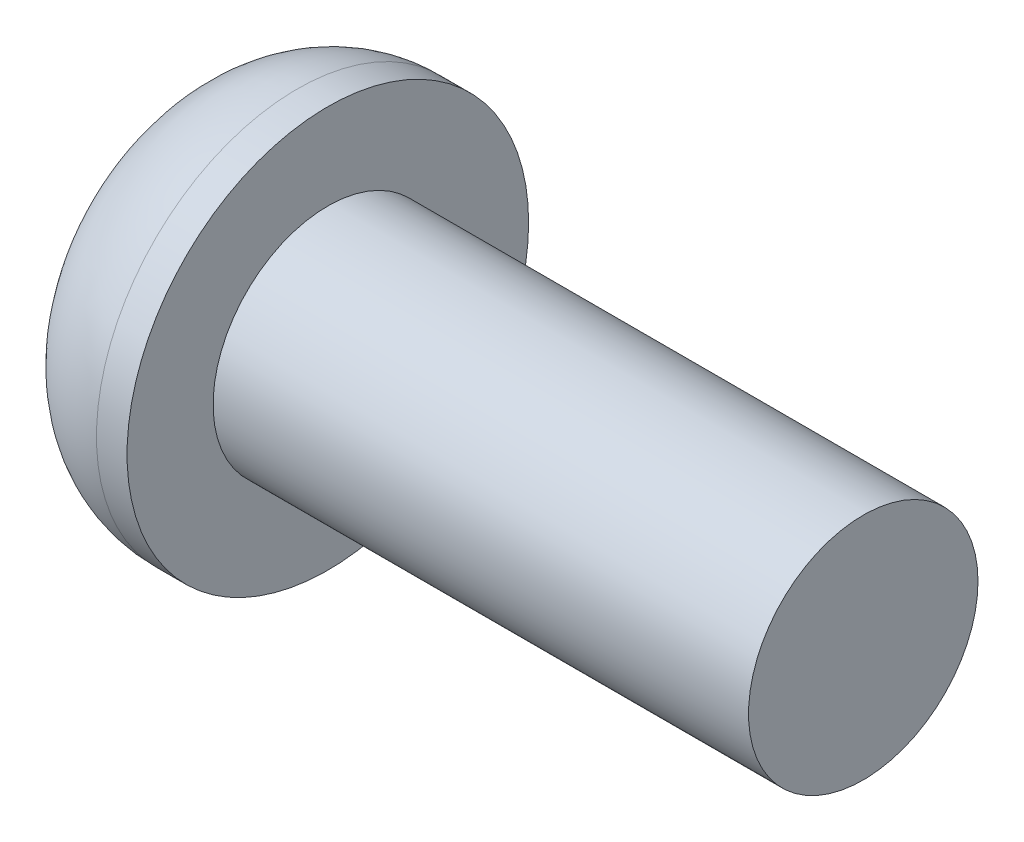
ISO-10303-21;
HEADER;
FILE_DESCRIPTION(('STEP AP214'),'2;1');
FILE_NAME('part.step','',(''),(''),'','','');
FILE_SCHEMA(('AUTOMOTIVE_DESIGN { 1 0 10303 214 1 1 1 1 }'));
ENDSEC;
DATA;
#1=APPLICATION_CONTEXT('core data for automotive mechanical design processes');
#2=APPLICATION_PROTOCOL_DEFINITION('international standard','automotive_design',2000,#1);
#3=PRODUCT_CONTEXT('',#1,'mechanical');
#4=PRODUCT('Part','Part','',(#3));
#5=PRODUCT_RELATED_PRODUCT_CATEGORY('part','',(#4));
#6=PRODUCT_DEFINITION_FORMATION('','',#4);
#7=PRODUCT_DEFINITION_CONTEXT('part definition',#1,'design');
#8=PRODUCT_DEFINITION('design','',#6,#7);
#9=PRODUCT_DEFINITION_SHAPE('','',#8);
#10=(LENGTH_UNIT() NAMED_UNIT(*) SI_UNIT(.MILLI.,.METRE.));
#11=(NAMED_UNIT(*) PLANE_ANGLE_UNIT() SI_UNIT($,.RADIAN.));
#12=(NAMED_UNIT(*) SI_UNIT($,.STERADIAN.) SOLID_ANGLE_UNIT());
#13=UNCERTAINTY_MEASURE_WITH_UNIT(LENGTH_MEASURE(1.E-05),#10,'distance_accuracy_value','');
#14=(GEOMETRIC_REPRESENTATION_CONTEXT(3) GLOBAL_UNCERTAINTY_ASSIGNED_CONTEXT((#13)) GLOBAL_UNIT_ASSIGNED_CONTEXT((#10,
#11,#12)) REPRESENTATION_CONTEXT('',''));
#15=CARTESIAN_POINT('',(0.,0.,0.));
#16=DIRECTION('',(0.,0.,1.));
#17=DIRECTION('',(1.,0.,0.));
#18=AXIS2_PLACEMENT_3D('',#15,#16,#17);
#19=CARTESIAN_POINT('',(0.,0.,0.));
#20=DIRECTION('',(-1.,0.,0.));
#21=DIRECTION('',(0.,0.,1.));
#22=AXIS2_PLACEMENT_3D('',#19,#20,#21);
#23=PLANE('',#22);
#24=DIRECTION('',(0.,0.866025403784439,0.5));
#25=VECTOR('',#24,1.);
#26=CARTESIAN_POINT('',(0.,-2.,1.15470053837925));
#27=LINE('',#26,#25);
#28=CARTESIAN_POINT('',(0.,-1.38971143170225,1.50705080756931));
#29=VERTEX_POINT('',#28);
#30=CARTESIAN_POINT('',(0.,-0.610288568297747,1.95705080756845));
#31=VERTEX_POINT('',#30);
#32=EDGE_CURVE('E161',#29,#31,#27,.T.);
#33=ORIENTED_EDGE('',*,*,#32,.F.);
#34=CARTESIAN_POINT('',(0.,0.,0.));
#35=DIRECTION('',(1.,0.,0.));
#36=DIRECTION('',(0.,0.,-1.));
#37=AXIS2_PLACEMENT_3D('',#34,#35,#36);
#38=CIRCLE('',#37,2.04999999999981);
#39=EDGE_CURVE('E284',#31,#29,#38,.T.);
#40=ORIENTED_EDGE('',*,*,#39,.F.);
#41=EDGE_LOOP('',(#33,#40));
#42=FACE_BOUND('',#41,.T.);
#43=ADVANCED_FACE('F32',(#42),#23,.T.);
#44=DIRECTION('',(0.,0.,1.));
#45=VECTOR('',#44,1.);
#46=CARTESIAN_POINT('',(0.,-2.,-1.15470053837925));
#47=LINE('',#46,#45);
#48=CARTESIAN_POINT('',(0.,-2.,-0.449999999999147));
#49=VERTEX_POINT('',#48);
#50=CARTESIAN_POINT('',(0.,-2.,0.449999999999148));
#51=VERTEX_POINT('',#50);
#52=EDGE_CURVE('E149',#49,#51,#47,.T.);
#53=ORIENTED_EDGE('',*,*,#52,.F.);
#54=EDGE_CURVE('E287',#51,#49,#38,.T.);
#55=ORIENTED_EDGE('',*,*,#54,.F.);
#56=EDGE_LOOP('',(#53,#55));
#57=FACE_BOUND('',#56,.T.);
#58=ADVANCED_FACE('F259',(#57),#23,.T.);
#59=DIRECTION('',(0.,-0.866025403784439,0.5));
#60=VECTOR('',#59,1.);
#61=CARTESIAN_POINT('',(0.,0.,-2.3094010767585));
#62=LINE('',#61,#60);
#63=CARTESIAN_POINT('',(0.,-0.610288568297741,-1.95705080756845));
#64=VERTEX_POINT('',#63);
#65=CARTESIAN_POINT('',(0.,-1.38971143170226,-1.5070508075693));
#66=VERTEX_POINT('',#65);
#67=EDGE_CURVE('E151',#64,#66,#62,.T.);
#68=ORIENTED_EDGE('',*,*,#67,.F.);
#69=EDGE_CURVE('E193',#66,#64,#38,.T.);
#70=ORIENTED_EDGE('',*,*,#69,.F.);
#71=EDGE_LOOP('',(#68,#70));
#72=FACE_BOUND('',#71,.T.);
#73=ADVANCED_FACE('F264',(#72),#23,.T.);
#74=DIRECTION('',(0.,-0.866025403784439,-0.5));
#75=VECTOR('',#74,1.);
#76=CARTESIAN_POINT('',(0.,2.,-1.15470053837925));
#77=LINE('',#76,#75);
#78=CARTESIAN_POINT('',(0.,1.38971143170226,-1.5070508075693));
#79=VERTEX_POINT('',#78);
#80=CARTESIAN_POINT('',(0.,0.610288568297742,-1.95705080756845));
#81=VERTEX_POINT('',#80);
#82=EDGE_CURVE('E166',#79,#81,#77,.T.);
#83=ORIENTED_EDGE('',*,*,#82,.F.);
#84=EDGE_CURVE('E194',#81,#79,#38,.T.);
#85=ORIENTED_EDGE('',*,*,#84,.F.);
#86=EDGE_LOOP('',(#83,#85));
#87=FACE_BOUND('',#86,.T.);
#88=ADVANCED_FACE('F276',(#87),#23,.T.);
#89=DIRECTION('',(0.,0.,-1.));
#90=VECTOR('',#89,1.);
#91=CARTESIAN_POINT('',(0.,2.,1.15470053837925));
#92=LINE('',#91,#90);
#93=CARTESIAN_POINT('',(0.,2.,0.449999999999146));
#94=VERTEX_POINT('',#93);
#95=CARTESIAN_POINT('',(0.,2.,-0.449999999999146));
#96=VERTEX_POINT('',#95);
#97=EDGE_CURVE('E164',#94,#96,#92,.T.);
#98=ORIENTED_EDGE('',*,*,#97,.F.);
#99=EDGE_CURVE('E198',#96,#94,#38,.T.);
#100=ORIENTED_EDGE('',*,*,#99,.F.);
#101=EDGE_LOOP('',(#98,#100));
#102=FACE_BOUND('',#101,.T.);
#103=ADVANCED_FACE('F268',(#102),#23,.T.);
#104=DIRECTION('',(0.,0.866025403784438,-0.5));
#105=VECTOR('',#104,1.);
#106=CARTESIAN_POINT('',(0.,0.,2.3094010767585));
#107=LINE('',#106,#105);
#108=CARTESIAN_POINT('',(0.,0.610288568297739,1.95705080756845));
#109=VERTEX_POINT('',#108);
#110=CARTESIAN_POINT('',(0.,1.38971143170226,1.5070508075693));
#111=VERTEX_POINT('',#110);
#112=EDGE_CURVE('E54',#109,#111,#107,.T.);
#113=ORIENTED_EDGE('',*,*,#112,.F.);
#114=EDGE_CURVE('E280',#111,#109,#38,.T.);
#115=ORIENTED_EDGE('',*,*,#114,.F.);
#116=EDGE_LOOP('',(#113,#115));
#117=FACE_BOUND('',#116,.T.);
#118=ADVANCED_FACE('F34',(#117),#23,.T.);
#119=CARTESIAN_POINT('',(3.20000000000019,0.,0.));
#120=DIRECTION('',(1.,0.,0.));
#121=DIRECTION('',(0.,0.,-1.));
#122=AXIS2_PLACEMENT_3D('',#119,#120,#121);
#123=DEGENERATE_TOROIDAL_SURFACE('',#122,2.04999999999981,3.20000000000019,.T.);
#124=CARTESIAN_POINT('',(0.0105406167446231,-2.0002,1.15458506832541));
#125=CARTESIAN_POINT('',(0.00664117854912433,-1.91688229776464,1.20268856613926));
#126=CARTESIAN_POINT('',(0.00417753331699307,-1.83353495783843,1.2508091752819));
#127=CARTESIAN_POINT('',(0.00106794947529185,-1.66682683048704,1.34705815748432));
#128=CARTESIAN_POINT('',(0.000421687089793824,-1.58346604810348,1.39518652763333));
#129=CARTESIAN_POINT('',(-0.00010761911535643,-1.41675645251678,1.4914363575218));
#130=CARTESIAN_POINT('',(9.25192736784387E-06,-1.33340763901583,1.53955781743321));
#131=CARTESIAN_POINT('',(0.000258385583432403,-1.16670588369395,1.63580312074268));
#132=CARTESIAN_POINT('',(0.000390648844765858,-1.08335294184698,1.68392696415578));
#133=CARTESIAN_POINT('',(0.000390648844765839,-0.916647058153024,1.78017465098198));
#134=CARTESIAN_POINT('',(0.000258385583432365,-0.833294116306049,1.82829849439507));
#135=CARTESIAN_POINT('',(9.25192736768791E-06,-0.666592360984166,1.92454379770455));
#136=CARTESIAN_POINT('',(-0.000107619115356685,-0.583243547483225,1.97266525761595));
#137=CARTESIAN_POINT('',(0.000421687089793677,-0.416533951896519,2.06891508750443));
#138=CARTESIAN_POINT('',(0.00106794947529191,-0.333173169512959,2.11704345765344));
#139=CARTESIAN_POINT('',(0.00417753331699326,-0.166465042161575,2.21329243985586));
#140=CARTESIAN_POINT('',(0.00664117854912444,-0.0831177022353576,2.2614130489985));
#141=CARTESIAN_POINT('',(0.0105406167446227,0.000199999999999651,2.30951654681234));
#142=B_SPLINE_CURVE_WITH_KNOTS('',3,(#124,#125,#126,#127,#128,#129,#130,#131,#132,#133,#134,
#135,#136,#137,#138,#139,#140,#141),.UNSPECIFIED.,.F.,.F.,(4,2,2,2,2,2,2,2,4),(0.,
0.288814329937899,0.577577202884326,0.866307861064927,1.15505067884557,1.44379349662621,
1.73252415480681,2.02128702775324,2.31010135769114),.UNSPECIFIED.);
#143=CARTESIAN_POINT('',(0.010531222698118,-2.,1.15470053837925));
#144=VERTEX_POINT('',#143);
#145=EDGE_CURVE('E11',#144,#29,#142,.T.);
#146=ORIENTED_EDGE('',*,*,#145,.F.);
#147=CARTESIAN_POINT('',(0.000390648844563418,-2.,0.));
#148=CARTESIAN_POINT('',(0.000388916290291673,-2.,0.083614024419002));
#149=CARTESIAN_POINT('',(0.000294961016210183,-2.,0.167228029526292));
#150=CARTESIAN_POINT('',(7.33656011319928E-05,-2.,0.334456689951084));
#151=CARTESIAN_POINT('',(-5.42749462442094E-05,-2.,0.418071345264261));
#152=CARTESIAN_POINT('',(9.9026167139026E-05,-2.,0.585336453695913));
#153=CARTESIAN_POINT('',(0.000380135255697929,-2.,0.668986907444867));
#154=CARTESIAN_POINT('',(0.00198161498522397,-2.,0.836276681697473));
#155=CARTESIAN_POINT('',(0.00330198450402564,-2.,0.919916002213049));
#156=CARTESIAN_POINT('',(0.00990874177777835,-2.,1.1704859408122));
#157=CARTESIAN_POINT('',(0.0178358773389069,-2.,1.33737685156857));
#158=CARTESIAN_POINT('',(0.0463966327415513,-2.,1.67005295609297));
#159=CARTESIAN_POINT('',(0.0670165227010465,-2.,1.83583914923513));
#160=CARTESIAN_POINT('',(0.114208843632242,-2.,2.10200251044517));
#161=CARTESIAN_POINT('',(0.135545087691405,-2.,2.20330479986803));
#162=CARTESIAN_POINT('',(0.185482432453743,-2.,2.40414359205348));
#163=CARTESIAN_POINT('',(0.214084710757365,-2.,2.50367980578939));
#164=CARTESIAN_POINT('',(0.279081004124637,-2.,2.70024195822511));
#165=CARTESIAN_POINT('',(0.31547855237929,-2.,2.79726673619553));
#166=CARTESIAN_POINT('',(0.396341964437799,-2.,2.98790264127201));
#167=CARTESIAN_POINT('',(0.440807347560848,-2.,3.08151397135212));
#168=CARTESIAN_POINT('',(0.53831581656335,-2.,3.26522431016494));
#169=CARTESIAN_POINT('',(0.591430486610918,-2.,3.3552854627745));
#170=CARTESIAN_POINT('',(0.70583149468764,-2.,3.53005528461691));
#171=CARTESIAN_POINT('',(0.767116948786012,-2.,3.61476453137002));
#172=CARTESIAN_POINT('',(0.8975713102187,-2.,3.77789665733377));
#173=CARTESIAN_POINT('',(0.966739962110468,-2.,3.85631974009742));
#174=CARTESIAN_POINT('',(1.11244341066968,-2.,4.00593761757554));
#175=CARTESIAN_POINT('',(1.18897717676414,-2.,4.07713342071981));
#176=CARTESIAN_POINT('',(1.40990833897083,-2.,4.26275012496424));
#177=CARTESIAN_POINT('',(1.56156159231435,-2.,4.36874590901151));
#178=CARTESIAN_POINT('',(1.8814637605388,-2.,4.55140057351885));
#179=CARTESIAN_POINT('',(2.04970352579627,-2.,4.62807551560914));
#180=CARTESIAN_POINT('',(2.38510548510189,-2.,4.74491683255247));
#181=CARTESIAN_POINT('',(2.55150377531688,-2.,4.78728013566301));
#182=CARTESIAN_POINT('',(2.8890979593217,-2.,4.84270140401037));
#183=CARTESIAN_POINT('',(3.06029286887629,-2.,4.85576533734134));
#184=CARTESIAN_POINT('',(3.39821911147901,-2.,4.85219069552503));
#185=CARTESIAN_POINT('',(3.56495844228162,-2.,4.83626145668961));
#186=CARTESIAN_POINT('',(3.89338943303934,-2.,4.7766133301739));
#187=CARTESIAN_POINT('',(4.05508100895309,-2.,4.73289398006751));
#188=CARTESIAN_POINT('',(4.36886231870803,-2.,4.61912819914962));
#189=CARTESIAN_POINT('',(4.52095405243817,-2.,4.54908727306863));
#190=CARTESIAN_POINT('',(4.81149742496475,-2.,4.38498519058825));
#191=CARTESIAN_POINT('',(4.94995217470088,-2.,4.29092953022426));
#192=CARTESIAN_POINT('',(5.21262747200964,-2.,4.07959825366387));
#193=CARTESIAN_POINT('',(5.33648762736063,-2.,3.96187609776255));
#194=CARTESIAN_POINT('',(5.56401634277204,-2.,3.70807401556308));
#195=CARTESIAN_POINT('',(5.66766260105318,-2.,3.57197409020784));
#196=CARTESIAN_POINT('',(5.80925789457159,-2.,3.35336895715406));
#197=CARTESIAN_POINT('',(5.85513676414212,-2.,3.27586118775976));
#198=CARTESIAN_POINT('',(5.94075735307755,-2.,3.11750322211606));
#199=CARTESIAN_POINT('',(5.98049865995432,-2.,3.03665280167909));
#200=CARTESIAN_POINT('',(6.05373032179732,-2.,2.87250868437411));
#201=CARTESIAN_POINT('',(6.08724117500105,-2.,2.78922408159436));
#202=CARTESIAN_POINT('',(6.14832834364035,-2.,2.62051986915736));
#203=CARTESIAN_POINT('',(6.17590501872864,-2.,2.53510038923904));
#204=CARTESIAN_POINT('',(6.22585565589426,-2.,2.36104083165567));
#205=CARTESIAN_POINT('',(6.24812319958891,-2.,2.27237040187932));
#206=CARTESIAN_POINT('',(6.28720863369723,-2.,2.09382307798533));
#207=CARTESIAN_POINT('',(6.30402502468491,-2.,2.00394585898914));
#208=CARTESIAN_POINT('',(6.33277969102287,-2.,1.82331883882505));
#209=CARTESIAN_POINT('',(6.34471221515045,-2.,1.7325681369683));
#210=CARTESIAN_POINT('',(6.36438163717915,-2.,1.55060528943868));
#211=CARTESIAN_POINT('',(6.3721176372418,-2.,1.4593930492304));
#212=CARTESIAN_POINT('',(6.39041228419079,-2.,1.18335367753333));
#213=CARTESIAN_POINT('',(6.39576430365758,-2.,0.998202228989591));
#214=CARTESIAN_POINT('',(6.39933389036973,-2.,0.720572834661133));
#215=CARTESIAN_POINT('',(6.39978119431541,-2.,0.628072781821954));
#216=CARTESIAN_POINT('',(6.40008789120602,-2.,0.443068700421198));
#217=CARTESIAN_POINT('',(6.39994730306063,-2.,0.350564672083199));
#218=CARTESIAN_POINT('',(6.39969384698773,-2.,0.158105673403426));
#219=CARTESIAN_POINT('',(6.3995841248598,-2.,0.0581508358983932));
#220=CARTESIAN_POINT('',(6.39964817119654,-2.,-0.141759779031458));
#221=CARTESIAN_POINT('',(6.3998219436993,-2.,-0.241715556449384));
#222=CARTESIAN_POINT('',(6.40004002320031,-2.,-0.441727910082696));
#223=CARTESIAN_POINT('',(6.40008420414425,-2.,-0.541784489802096));
#224=CARTESIAN_POINT('',(6.39911991309886,-2.,-0.741883917848651));
#225=CARTESIAN_POINT('',(6.3981114385633,-2.,-0.841926766142006));
#226=CARTESIAN_POINT('',(6.3917035449667,-2.,-1.14004904005377));
#227=CARTESIAN_POINT('',(6.38296997469166,-2.,-1.33814084031703));
#228=CARTESIAN_POINT('',(6.35615694642755,-2.,-1.63392229458638));
#229=CARTESIAN_POINT('',(6.34494882028323,-2.,-1.73220894241901));
#230=CARTESIAN_POINT('',(6.31704510109669,-2.,-1.92798927336831));
#231=CARTESIAN_POINT('',(6.30035103300402,-2.,-2.02548316914066));
#232=CARTESIAN_POINT('',(6.2607846351801,-2.,-2.21882928781068));
#233=CARTESIAN_POINT('',(6.23793667940662,-2.,-2.314686433816));
#234=CARTESIAN_POINT('',(6.1854651424377,-2.,-2.50458187761333));
#235=CARTESIAN_POINT('',(6.15583903555902,-2.,-2.59861948320384));
#236=CARTESIAN_POINT('',(6.0893899357679,-2.,-2.7842926126749));
#237=CARTESIAN_POINT('',(6.05255605051094,-2.,-2.87592425998423));
#238=CARTESIAN_POINT('',(5.97152761995712,-2.,-3.05587117794695));
#239=CARTESIAN_POINT('',(5.92733403380227,-2.,-3.14418687891057));
#240=CARTESIAN_POINT('',(5.83123330091599,-2.,-3.31729786425876));
#241=CARTESIAN_POINT('',(5.77927690902879,-2.,-3.40206589534637));
#242=CARTESIAN_POINT('',(5.66800733702573,-2.,-3.56662463346645));
#243=CARTESIAN_POINT('',(5.60869480391146,-2.,-3.6464157773093));
#244=CARTESIAN_POINT('',(5.48297845150779,-2.,-3.80022230829932));
#245=CARTESIAN_POINT('',(5.41657459049872,-2.,-3.87423766146195));
#246=CARTESIAN_POINT('',(5.27713552278688,-2.,-4.01568336960477));
#247=CARTESIAN_POINT('',(5.20410093410765,-2.,-4.08311433707568));
#248=CARTESIAN_POINT('',(4.9873875717098,-2.,-4.26470800310395));
#249=CARTESIAN_POINT('',(4.83621025566948,-2.,-4.37015143241766));
#250=CARTESIAN_POINT('',(4.51739863619901,-2.,-4.55191529677997));
#251=CARTESIAN_POINT('',(4.34977225851968,-2.,-4.62824967182762));
#252=CARTESIAN_POINT('',(4.01504309765868,-2.,-4.74487295816118));
#253=CARTESIAN_POINT('',(3.84866381813474,-2.,-4.7872414191447));
#254=CARTESIAN_POINT('',(3.51110231450898,-2.,-4.84267971245903));
#255=CARTESIAN_POINT('',(3.33992092110264,-2.,-4.85575458089316));
#256=CARTESIAN_POINT('',(3.00200252002735,-2.,-4.85220573152867));
#257=CARTESIAN_POINT('',(2.83525760830666,-2.,-4.83628848486376));
#258=CARTESIAN_POINT('',(2.50682171313129,-2.,-4.77666387015624));
#259=CARTESIAN_POINT('',(2.34513057122483,-2.,-4.73295737431387));
#260=CARTESIAN_POINT('',(2.03135632731202,-2.,-4.61922076936278));
#261=CARTESIAN_POINT('',(1.87927070488133,-2.,-4.54919759937378));
#262=CARTESIAN_POINT('',(1.58871377698702,-2.,-4.38512107031362));
#263=CARTESIAN_POINT('',(1.45024138973157,-2.,-4.29106962281892));
#264=CARTESIAN_POINT('',(1.18750697783543,-2.,-4.07972237571905));
#265=CARTESIAN_POINT('',(1.06360863819637,-2.,-3.96197588388512));
#266=CARTESIAN_POINT('',(0.836074098993482,-2.,-3.70818248771566));
#267=CARTESIAN_POINT('',(0.73244942873765,-2.,-3.57212524415017));
#268=CARTESIAN_POINT('',(0.590908485474325,-2.,-3.35363735787178));
#269=CARTESIAN_POINT('',(0.545063005324332,-2.,-3.27620456086666));
#270=CARTESIAN_POINT('',(0.459497582380795,-2.,-3.11800065969786));
#271=CARTESIAN_POINT('',(0.419778118755337,-2.,-3.03722929502221));
#272=CARTESIAN_POINT('',(0.346514578991059,-2.,-2.87310110634625));
#273=CARTESIAN_POINT('',(0.312960819745775,-2.,-2.78974858082008));
#274=CARTESIAN_POINT('',(0.251799424144532,-2.,-2.62090588620951));
#275=CARTESIAN_POINT('',(0.224191284243009,-2.,-2.53541589883571));
#276=CARTESIAN_POINT('',(0.174133118365059,-2.,-2.36102214502514));
#277=CARTESIAN_POINT('',(0.151802335683953,-2.,-2.27208435860149));
#278=CARTESIAN_POINT('',(0.112622221493986,-2.,-2.09299592722068));
#279=CARTESIAN_POINT('',(0.0957744145119987,-2.,-2.00284495218305));
#280=CARTESIAN_POINT('',(0.0669826531866311,-2.,-1.82166439441248));
#281=CARTESIAN_POINT('',(0.0550446465040569,-2.,-1.73063388197957));
#282=CARTESIAN_POINT('',(0.035383648192888,-2.,-1.54811088866639));
#283=CARTESIAN_POINT('',(0.0276615647918848,-2.,-1.45661831252578));
#284=CARTESIAN_POINT('',(0.00950590732444865,-2.,-1.18097371396941));
#285=CARTESIAN_POINT('',(0.00420221665067436,-2.,-0.996504256603975));
#286=CARTESIAN_POINT('',(0.000663085289595214,-2.,-0.719878155437179));
#287=CARTESIAN_POINT('',(0.000219109813570109,-2.,-0.627699849001262));
#288=CARTESIAN_POINT('',(-8.83657034975882E-05,-2.,-0.44333860757143));
#289=CARTESIAN_POINT('',(4.81185553726301E-05,-2.,-0.35115567277014));
#290=CARTESIAN_POINT('',(0.00023193074307832,-2.,-0.215797133245246));
#291=CARTESIAN_POINT('',(0.000288083367765182,-2.,-0.17262048180127));
#292=CARTESIAN_POINT('',(0.000367878584137435,-2.,-0.0862958851066697));
#293=CARTESIAN_POINT('',(0.000391542906872371,-2.,-0.0431479399820349));
#294=CARTESIAN_POINT('',(0.000390648844563418,-2.,0.));
#295=B_SPLINE_CURVE_WITH_KNOTS('',3,(#147,#148,#149,#150,#151,#152,#153,#154,#155,#156,#157,
#158,#159,#160,#161,#162,#163,#164,#165,#166,#167,#168,#169,#170,#171,#172,#173,#174,#175,#176,
#177,#178,#179,#180,#181,#182,#183,#184,#185,#186,#187,#188,#189,#190,#191,#192,#193,#194,#195,
#196,#197,#198,#199,#200,#201,#202,#203,#204,#205,#206,#207,#208,#209,#210,#211,#212,#213,#214,
#215,#216,#217,#218,#219,#220,#221,#222,#223,#224,#225,#226,#227,#228,#229,#230,#231,#232,#233,
#234,#235,#236,#237,#238,#239,#240,#241,#242,#243,#244,#245,#246,#247,#248,#249,#250,#251,#252,
#253,#254,#255,#256,#257,#258,#259,#260,#261,#262,#263,#264,#265,#266,#267,#268,#269,#270,#271,
#272,#273,#274,#275,#276,#277,#278,#279,#280,#281,#282,#283,#284,#285,#286,#287,#288,#289,#290,
#291,#292,#293,#294),.UNSPECIFIED.,.T.,.F.,(4,2,2,2,2,2,2,2,2,2,2,2,2,2,2,2,2,2,2,2,2,2,2,2,2,2,
2,2,2,2,2,2,2,2,2,2,2,2,2,2,2,2,2,2,2,2,2,2,2,2,2,2,2,2,2,2,2,2,2,2,2,2,2,2,2,2,2,2,2,2,2,2,2,
4),(0.,0.250841940342383,0.501686906982993,0.752634651093908,1.00358212423857,1.50455245545905,
2.0049818319268,2.31532421391156,2.62571692496571,2.93625061977651,3.24676581909208,
3.55999538500628,3.87319109261122,4.18637665448875,4.49951845702196,5.05138568625849,
5.60295017424777,6.11553986346438,6.62802513195474,7.12814022896245,7.62826364807917,
8.12828253265153,8.62818708483043,9.13859998939591,9.64957288039267,9.9195491524335,
10.1895435609226,10.4586333281936,10.7277067821448,11.0017896457224,11.2759478362893,
11.5504279519769,11.8249667690328,12.3803217811837,12.6578385461362,12.9353463847744,
13.2352116537555,13.5350811940492,13.8352423222755,14.1354041765514,14.7296705114639,
15.0263109813449,15.3228690625224,15.6182694003918,15.9137799904988,16.209740651788,
16.5056627725879,16.803548802755,17.1014086512284,17.3992702521662,17.6971041190642,
18.2468740039997,18.7963802786915,19.3089169234534,19.8213654470461,20.3214934147627,
20.8216056861144,21.3215861814327,21.8215269130399,22.3320711250698,22.842904836753,
23.1126371616207,23.3823905738696,23.651716654306,23.9210199160376,24.1959251186072,
24.4709066926646,24.7462204011643,25.0215933965445,25.5749048233596,25.8514562272192,
26.1280001510534,26.2575305861035,26.3869743374607),.UNSPECIFIED.);
#296=EDGE_CURVE('E45',#51,#144,#295,.T.);
#297=ORIENTED_EDGE('',*,*,#296,.F.);
#298=ORIENTED_EDGE('',*,*,#54,.T.);
#299=CARTESIAN_POINT('',(0.0105312226992274,-2.,-1.15470053837925));
#300=VERTEX_POINT('',#299);
#301=EDGE_CURVE('E36',#300,#49,#295,.T.);
#302=ORIENTED_EDGE('',*,*,#301,.F.);
#303=CARTESIAN_POINT('',(0.0105406167446229,0.000200000000000488,-2.30951654681234));
#304=CARTESIAN_POINT('',(0.00664117854912483,-0.0831177022353571,-2.2614130489985));
#305=CARTESIAN_POINT('',(0.00417753331699353,-0.166465042161574,-2.21329243985585));
#306=CARTESIAN_POINT('',(0.00106794947529184,-0.333173169512958,-2.11704345765343));
#307=CARTESIAN_POINT('',(0.000421687089793387,-0.416533951896518,-2.06891508750443));
#308=CARTESIAN_POINT('',(-0.00010761911535704,-0.583243547483225,-1.97266525761595));
#309=CARTESIAN_POINT('',(9.25192736749402E-06,-0.666592360984166,-1.92454379770455));
#310=CARTESIAN_POINT('',(0.000258385583432364,-0.833294116306049,-1.82829849439507));
#311=CARTESIAN_POINT('',(0.000390648844765869,-0.916647058153024,-1.78017465098197));
#312=CARTESIAN_POINT('',(0.000390648844765874,-1.08335294184698,-1.68392696415578));
#313=CARTESIAN_POINT('',(0.000258385583432374,-1.16670588369395,-1.63580312074268));
#314=CARTESIAN_POINT('',(9.25192736751146E-06,-1.33340763901583,-1.53955781743321));
#315=CARTESIAN_POINT('',(-0.00010761911535702,-1.41675645251678,-1.4914363575218));
#316=CARTESIAN_POINT('',(0.000421687089793411,-1.58346604810348,-1.39518652763332));
#317=CARTESIAN_POINT('',(0.00106794947529187,-1.66682683048704,-1.34705815748432));
#318=CARTESIAN_POINT('',(0.00417753331699357,-1.83353495783843,-1.2508091752819));
#319=CARTESIAN_POINT('',(0.00664117854912487,-1.91688229776464,-1.20268856613926));
#320=CARTESIAN_POINT('',(0.0105406167446229,-2.0002,-1.15458506832541));
#321=B_SPLINE_CURVE_WITH_KNOTS('',3,(#303,#304,#305,#306,#307,#308,#309,#310,#311,#312,#313,
#314,#315,#316,#317,#318,#319,#320),.UNSPECIFIED.,.F.,.F.,(4,2,2,2,2,2,2,2,4),(0.,
0.288814329937899,0.577577202884327,0.866307861064928,1.15505067884557,1.44379349662621,
1.73252415480682,2.02128702775324,2.31010135769114),.UNSPECIFIED.);
#322=EDGE_CURVE('E297',#66,#300,#321,.T.);
#323=ORIENTED_EDGE('',*,*,#322,.F.);
#324=ORIENTED_EDGE('',*,*,#69,.T.);
#325=CARTESIAN_POINT('',(0.0105312226992274,0.,-2.3094010767585));
#326=VERTEX_POINT('',#325);
#327=EDGE_CURVE('E238',#326,#64,#321,.T.);
#328=ORIENTED_EDGE('',*,*,#327,.F.);
#329=CARTESIAN_POINT('',(0.0105406167446231,2.0002,-1.15458506832541));
#330=CARTESIAN_POINT('',(0.00664117854912433,1.91688229776464,-1.20268856613926));
#331=CARTESIAN_POINT('',(0.00417753331699307,1.83353495783843,-1.2508091752819));
#332=CARTESIAN_POINT('',(0.00106794947529185,1.66682683048704,-1.34705815748432));
#333=CARTESIAN_POINT('',(0.00042168708979383,1.58346604810348,-1.39518652763332));
#334=CARTESIAN_POINT('',(-0.000107619115356419,1.41675645251678,-1.4914363575218));
#335=CARTESIAN_POINT('',(9.25192736785842E-06,1.33340763901583,-1.53955781743321));
#336=CARTESIAN_POINT('',(0.000258385583432423,1.16670588369395,-1.63580312074268));
#337=CARTESIAN_POINT('',(0.00039064884476588,1.08335294184698,-1.68392696415578));
#338=CARTESIAN_POINT('',(0.000390648844765864,0.916647058153025,-1.78017465098198));
#339=CARTESIAN_POINT('',(0.000258385583432391,0.833294116306049,-1.82829849439507));
#340=CARTESIAN_POINT('',(9.2519273677166E-06,0.666592360984166,-1.92454379770455));
#341=CARTESIAN_POINT('',(-0.000107619115356654,0.583243547483225,-1.97266525761595));
#342=CARTESIAN_POINT('',(0.000421687089793716,0.416533951896519,-2.06891508750443));
#343=CARTESIAN_POINT('',(0.00106794947529195,0.333173169512959,-2.11704345765343));
#344=CARTESIAN_POINT('',(0.0041775333169933,0.166465042161575,-2.21329243985585));
#345=CARTESIAN_POINT('',(0.00664117854912449,0.083117702235358,-2.2614130489985));
#346=CARTESIAN_POINT('',(0.0105406167446227,-0.000199999999999543,-2.30951654681234));
#347=B_SPLINE_CURVE_WITH_KNOTS('',3,(#329,#330,#331,#332,#333,#334,#335,#336,#337,#338,#339,
#340,#341,#342,#343,#344,#345,#346),.UNSPECIFIED.,.F.,.F.,(4,2,2,2,2,2,2,2,4),(0.,
0.288814329937899,0.577577202884326,0.866307861064928,1.15505067884557,1.44379349662621,
1.73252415480681,2.02128702775324,2.31010135769114),.UNSPECIFIED.);
#348=EDGE_CURVE('E237',#81,#326,#347,.T.);
#349=ORIENTED_EDGE('',*,*,#348,.F.);
#350=ORIENTED_EDGE('',*,*,#84,.T.);
#351=CARTESIAN_POINT('',(0.0105312226981085,2.,-1.15470053837925));
#352=VERTEX_POINT('',#351);
#353=EDGE_CURVE('E232',#352,#79,#347,.T.);
#354=ORIENTED_EDGE('',*,*,#353,.F.);
#355=CARTESIAN_POINT('',(0.000390648844563367,2.,0.));
#356=CARTESIAN_POINT('',(0.000388916290291612,2.,-0.0836140244190011));
#357=CARTESIAN_POINT('',(0.000294961016210111,2.,-0.167228029526291));
#358=CARTESIAN_POINT('',(7.33656011319041E-05,2.,-0.334456689951083));
#359=CARTESIAN_POINT('',(-5.42749462443031E-05,2.,-0.41807134526426));
#360=CARTESIAN_POINT('',(9.90261671389232E-05,2.,-0.585336453695912));
#361=CARTESIAN_POINT('',(0.000380135255697822,2.,-0.668986907444866));
#362=CARTESIAN_POINT('',(0.00198161498522386,2.,-0.836276681697472));
#363=CARTESIAN_POINT('',(0.00330198450402554,2.,-0.919916002213048));
#364=CARTESIAN_POINT('',(0.0099087417777783,2.,-1.1704859408122));
#365=CARTESIAN_POINT('',(0.0178358773389069,2.,-1.33737685156857));
#366=CARTESIAN_POINT('',(0.0463966327415514,2.,-1.67005295609297));
#367=CARTESIAN_POINT('',(0.0670165227010465,2.,-1.83583914923513));
#368=CARTESIAN_POINT('',(0.114208843632242,2.,-2.10200251044517));
#369=CARTESIAN_POINT('',(0.135545087691405,2.,-2.20330479986803));
#370=CARTESIAN_POINT('',(0.185482432453743,2.,-2.40414359205348));
#371=CARTESIAN_POINT('',(0.214084710757364,2.,-2.50367980578939));
#372=CARTESIAN_POINT('',(0.279081004124638,2.,-2.70024195822511));
#373=CARTESIAN_POINT('',(0.31547855237929,2.,-2.79726673619553));
#374=CARTESIAN_POINT('',(0.396341964437799,2.,-2.98790264127201));
#375=CARTESIAN_POINT('',(0.440807347560848,2.,-3.08151397135212));
#376=CARTESIAN_POINT('',(0.53831581656335,2.,-3.26522431016494));
#377=CARTESIAN_POINT('',(0.591430486610918,2.,-3.3552854627745));
#378=CARTESIAN_POINT('',(0.70583149468764,2.,-3.53005528461691));
#379=CARTESIAN_POINT('',(0.767116948786011,2.,-3.61476453137002));
#380=CARTESIAN_POINT('',(0.8975713102187,2.,-3.77789665733377));
#381=CARTESIAN_POINT('',(0.966739962110468,2.,-3.85631974009742));
#382=CARTESIAN_POINT('',(1.11244341066968,2.,-4.00593761757554));
#383=CARTESIAN_POINT('',(1.18897717676414,2.,-4.07713342071981));
#384=CARTESIAN_POINT('',(1.40990833897082,2.,-4.26275012496424));
#385=CARTESIAN_POINT('',(1.56156159231435,2.,-4.36874590901151));
#386=CARTESIAN_POINT('',(1.8814637605388,2.,-4.55140057351885));
#387=CARTESIAN_POINT('',(2.04970352579627,2.,-4.62807551560914));
#388=CARTESIAN_POINT('',(2.38510548510189,2.,-4.74491683255247));
#389=CARTESIAN_POINT('',(2.55150377531688,2.,-4.78728013566301));
#390=CARTESIAN_POINT('',(2.8890979593217,2.,-4.84270140401037));
#391=CARTESIAN_POINT('',(3.06029286887629,2.,-4.85576533734134));
#392=CARTESIAN_POINT('',(3.39821911147901,2.,-4.85219069552503));
#393=CARTESIAN_POINT('',(3.56495844228162,2.,-4.8362614566896));
#394=CARTESIAN_POINT('',(3.89338943303934,2.,-4.7766133301739));
#395=CARTESIAN_POINT('',(4.05508100895309,2.,-4.73289398006751));
#396=CARTESIAN_POINT('',(4.36886231870803,2.,-4.61912819914962));
#397=CARTESIAN_POINT('',(4.52095405243817,2.,-4.54908727306863));
#398=CARTESIAN_POINT('',(4.81149742496475,2.,-4.38498519058825));
#399=CARTESIAN_POINT('',(4.94995217470088,2.,-4.29092953022427));
#400=CARTESIAN_POINT('',(5.21262747200964,2.,-4.07959825366387));
#401=CARTESIAN_POINT('',(5.33648762736063,2.,-3.96187609776255));
#402=CARTESIAN_POINT('',(5.56401634277204,2.,-3.70807401556307));
#403=CARTESIAN_POINT('',(5.66766260105318,2.,-3.57197409020784));
#404=CARTESIAN_POINT('',(5.8092578945716,2.,-3.35336895715406));
#405=CARTESIAN_POINT('',(5.85513676414212,2.,-3.27586118775976));
#406=CARTESIAN_POINT('',(5.94075735307755,2.,-3.11750322211605));
#407=CARTESIAN_POINT('',(5.98049865995432,2.,-3.03665280167909));
#408=CARTESIAN_POINT('',(6.05373032179732,2.,-2.87250868437411));
#409=CARTESIAN_POINT('',(6.08724117500105,2.,-2.78922408159436));
#410=CARTESIAN_POINT('',(6.14832834364035,2.,-2.62051986915736));
#411=CARTESIAN_POINT('',(6.17590501872864,2.,-2.53510038923904));
#412=CARTESIAN_POINT('',(6.22585565589426,2.,-2.36104083165567));
#413=CARTESIAN_POINT('',(6.24812319958891,2.,-2.27237040187932));
#414=CARTESIAN_POINT('',(6.28720863369723,2.,-2.09382307798533));
#415=CARTESIAN_POINT('',(6.30402502468491,2.,-2.00394585898914));
#416=CARTESIAN_POINT('',(6.33277969102287,2.,-1.82331883882505));
#417=CARTESIAN_POINT('',(6.34471221515045,2.,-1.7325681369683));
#418=CARTESIAN_POINT('',(6.36438163717915,2.,-1.55060528943868));
#419=CARTESIAN_POINT('',(6.3721176372418,2.,-1.4593930492304));
#420=CARTESIAN_POINT('',(6.39041228419079,2.,-1.18335367753332));
#421=CARTESIAN_POINT('',(6.39576430365758,2.,-0.998202228989588));
#422=CARTESIAN_POINT('',(6.39933389036973,2.,-0.720572834661129));
#423=CARTESIAN_POINT('',(6.39978119431541,2.,-0.628072781821951));
#424=CARTESIAN_POINT('',(6.40008789120602,2.,-0.443068700421195));
#425=CARTESIAN_POINT('',(6.39994730306063,2.,-0.350564672083196));
#426=CARTESIAN_POINT('',(6.39969384698773,2.,-0.158105673403422));
#427=CARTESIAN_POINT('',(6.3995841248598,2.,-0.0581508358983887));
#428=CARTESIAN_POINT('',(6.39964817119654,2.,0.141759779031463));
#429=CARTESIAN_POINT('',(6.3998219436993,2.,0.241715556449389));
#430=CARTESIAN_POINT('',(6.40004002320031,2.,0.4417279100827));
#431=CARTESIAN_POINT('',(6.40008420414425,2.,0.541784489802101));
#432=CARTESIAN_POINT('',(6.39911991309886,2.,0.741883917848656));
#433=CARTESIAN_POINT('',(6.3981114385633,2.,0.841926766142012));
#434=CARTESIAN_POINT('',(6.3917035449667,2.,1.14004904005377));
#435=CARTESIAN_POINT('',(6.38296997469166,2.,1.33814084031704));
#436=CARTESIAN_POINT('',(6.35615694642755,2.,1.63392229458638));
#437=CARTESIAN_POINT('',(6.34494882028323,2.,1.73220894241902));
#438=CARTESIAN_POINT('',(6.31704510109669,2.,1.92798927336832));
#439=CARTESIAN_POINT('',(6.30035103300402,2.,2.02548316914067));
#440=CARTESIAN_POINT('',(6.2607846351801,2.,2.21882928781069));
#441=CARTESIAN_POINT('',(6.23793667940662,2.,2.31468643381601));
#442=CARTESIAN_POINT('',(6.1854651424377,2.,2.50458187761334));
#443=CARTESIAN_POINT('',(6.15583903555902,2.,2.59861948320385));
#444=CARTESIAN_POINT('',(6.08938993576789,2.,2.78429261267491));
#445=CARTESIAN_POINT('',(6.05255605051093,2.,2.87592425998424));
#446=CARTESIAN_POINT('',(5.97152761995712,2.,3.05587117794696));
#447=CARTESIAN_POINT('',(5.92733403380226,2.,3.14418687891058));
#448=CARTESIAN_POINT('',(5.83123330091599,2.,3.31729786425877));
#449=CARTESIAN_POINT('',(5.77927690902879,2.,3.40206589534638));
#450=CARTESIAN_POINT('',(5.66800733702573,2.,3.56662463346646));
#451=CARTESIAN_POINT('',(5.60869480391145,2.,3.64641577730931));
#452=CARTESIAN_POINT('',(5.48297845150778,2.,3.80022230829933));
#453=CARTESIAN_POINT('',(5.41657459049871,2.,3.87423766146196));
#454=CARTESIAN_POINT('',(5.27713552278687,2.,4.01568336960477));
#455=CARTESIAN_POINT('',(5.20410093410765,2.,4.08311433707569));
#456=CARTESIAN_POINT('',(4.98738757170979,2.,4.26470800310395));
#457=CARTESIAN_POINT('',(4.83621025566948,2.,4.37015143241767));
#458=CARTESIAN_POINT('',(4.51739863619901,2.,4.55191529677998));
#459=CARTESIAN_POINT('',(4.34977225851967,2.,4.62824967182762));
#460=CARTESIAN_POINT('',(4.01504309765867,2.,4.74487295816118));
#461=CARTESIAN_POINT('',(3.84866381813473,2.,4.7872414191447));
#462=CARTESIAN_POINT('',(3.51110231450897,2.,4.84267971245903));
#463=CARTESIAN_POINT('',(3.33992092110263,2.,4.85575458089316));
#464=CARTESIAN_POINT('',(3.00200252002735,2.,4.85220573152867));
#465=CARTESIAN_POINT('',(2.83525760830666,2.,4.83628848486376));
#466=CARTESIAN_POINT('',(2.50682171313128,2.,4.77666387015624));
#467=CARTESIAN_POINT('',(2.34513057122483,2.,4.73295737431387));
#468=CARTESIAN_POINT('',(2.03135632731202,2.,4.61922076936278));
#469=CARTESIAN_POINT('',(1.87927070488133,2.,4.54919759937378));
#470=CARTESIAN_POINT('',(1.58871377698701,2.,4.38512107031362));
#471=CARTESIAN_POINT('',(1.45024138973157,2.,4.29106962281892));
#472=CARTESIAN_POINT('',(1.18750697783543,2.,4.07972237571905));
#473=CARTESIAN_POINT('',(1.06360863819636,2.,3.96197588388512));
#474=CARTESIAN_POINT('',(0.83607409899348,2.,3.70818248771566));
#475=CARTESIAN_POINT('',(0.732449428737648,2.,3.57212524415017));
#476=CARTESIAN_POINT('',(0.590908485474324,2.,3.35363735787177));
#477=CARTESIAN_POINT('',(0.545063005324331,2.,3.27620456086666));
#478=CARTESIAN_POINT('',(0.459497582380793,2.,3.11800065969786));
#479=CARTESIAN_POINT('',(0.419778118755336,2.,3.03722929502221));
#480=CARTESIAN_POINT('',(0.346514578991057,2.,2.87310110634625));
#481=CARTESIAN_POINT('',(0.312960819745774,2.,2.78974858082007));
#482=CARTESIAN_POINT('',(0.251799424144531,2.,2.6209058862095));
#483=CARTESIAN_POINT('',(0.224191284243008,2.,2.53541589883571));
#484=CARTESIAN_POINT('',(0.174133118365058,2.,2.36102214502514));
#485=CARTESIAN_POINT('',(0.151802335683953,2.,2.27208435860149));
#486=CARTESIAN_POINT('',(0.112622221493986,2.,2.09299592722068));
#487=CARTESIAN_POINT('',(0.0957744145119976,2.,2.00284495218305));
#488=CARTESIAN_POINT('',(0.0669826531866297,2.,1.82166439441248));
#489=CARTESIAN_POINT('',(0.0550446465040558,2.,1.73063388197956));
#490=CARTESIAN_POINT('',(0.0353836481928875,2.,1.54811088866639));
#491=CARTESIAN_POINT('',(0.0276615647918844,2.,1.45661831252578));
#492=CARTESIAN_POINT('',(0.0095059073244484,2.,1.1809737139694));
#493=CARTESIAN_POINT('',(0.00420221665067431,2.,0.996504256603967));
#494=CARTESIAN_POINT('',(0.000663085289595262,2.,0.71987815543717));
#495=CARTESIAN_POINT('',(0.000219109813570154,2.,0.627699849001253));
#496=CARTESIAN_POINT('',(-8.83657034975605E-05,2.,0.443338607571421));
#497=CARTESIAN_POINT('',(4.81185553726431E-05,2.,0.351155672770131));
#498=CARTESIAN_POINT('',(0.000231930743078306,2.,0.21579713324524));
#499=CARTESIAN_POINT('',(0.000288083367765157,2.,0.172620481801265));
#500=CARTESIAN_POINT('',(0.000367878584137395,2.,0.0862958851066684));
#501=CARTESIAN_POINT('',(0.000391542906872324,2.,0.0431479399820347));
#502=CARTESIAN_POINT('',(0.000390648844563367,2.,0.));
#503=B_SPLINE_CURVE_WITH_KNOTS('',3,(#355,#356,#357,#358,#359,#360,#361,#362,#363,#364,#365,
#366,#367,#368,#369,#370,#371,#372,#373,#374,#375,#376,#377,#378,#379,#380,#381,#382,#383,#384,
#385,#386,#387,#388,#389,#390,#391,#392,#393,#394,#395,#396,#397,#398,#399,#400,#401,#402,#403,
#404,#405,#406,#407,#408,#409,#410,#411,#412,#413,#414,#415,#416,#417,#418,#419,#420,#421,#422,
#423,#424,#425,#426,#427,#428,#429,#430,#431,#432,#433,#434,#435,#436,#437,#438,#439,#440,#441,
#442,#443,#444,#445,#446,#447,#448,#449,#450,#451,#452,#453,#454,#455,#456,#457,#458,#459,#460,
#461,#462,#463,#464,#465,#466,#467,#468,#469,#470,#471,#472,#473,#474,#475,#476,#477,#478,#479,
#480,#481,#482,#483,#484,#485,#486,#487,#488,#489,#490,#491,#492,#493,#494,#495,#496,#497,#498,
#499,#500,#501,#502),.UNSPECIFIED.,.T.,.F.,(4,2,2,2,2,2,2,2,2,2,2,2,2,2,2,2,2,2,2,2,2,2,2,2,2,2,
2,2,2,2,2,2,2,2,2,2,2,2,2,2,2,2,2,2,2,2,2,2,2,2,2,2,2,2,2,2,2,2,2,2,2,2,2,2,2,2,2,2,2,2,2,2,2,
4),(0.,0.250841940342383,0.501686906982993,0.752634651093908,1.00358212423857,1.50455245545905,
2.0049818319268,2.31532421391156,2.62571692496571,2.93625061977651,3.24676581909208,
3.55999538500628,3.87319109261122,4.18637665448875,4.49951845702196,5.05138568625849,
5.60295017424777,6.11553986346438,6.62802513195474,7.12814022896245,7.62826364807917,
8.12828253265153,8.62818708483043,9.13859998939591,9.64957288039267,9.9195491524335,
10.1895435609226,10.4586333281936,10.7277067821448,11.0017896457224,11.2759478362893,
11.5504279519769,11.8249667690328,12.3803217811837,12.6578385461362,12.9353463847744,
13.2352116537555,13.5350811940492,13.8352423222755,14.1354041765514,14.729670511464,
15.0263109813449,15.3228690625224,15.6182694003919,15.9137799904988,16.209740651788,
16.5056627725879,16.803548802755,17.1014086512284,17.3992702521662,17.6971041190642,
18.2468740039997,18.7963802786915,19.3089169234534,19.8213654470461,20.3214934147627,
20.8216056861144,21.3215861814327,21.8215269130399,22.3320711250698,22.842904836753,
23.1126371616207,23.3823905738696,23.651716654306,23.9210199160376,24.1959251186072,
24.4709066926646,24.7462204011643,25.0215933965445,25.5749048233596,25.8514562272192,
26.1280001510534,26.2575305861035,26.3869743374607),.UNSPECIFIED.);
#504=EDGE_CURVE('E231',#96,#352,#503,.T.);
#505=ORIENTED_EDGE('',*,*,#504,.F.);
#506=ORIENTED_EDGE('',*,*,#99,.T.);
#507=CARTESIAN_POINT('',(0.0105312226992274,2.,1.15470053837925));
#508=VERTEX_POINT('',#507);
#509=EDGE_CURVE('E205',#508,#94,#503,.T.);
#510=ORIENTED_EDGE('',*,*,#509,.F.);
#511=CARTESIAN_POINT('',(0.010540616744623,-0.000200000000000924,2.30951654681234));
#512=CARTESIAN_POINT('',(0.00664117854912451,0.0831177022353565,2.2614130489985));
#513=CARTESIAN_POINT('',(0.00417753331699336,0.166465042161574,2.21329243985586));
#514=CARTESIAN_POINT('',(0.00106794947529211,0.333173169512958,2.11704345765344));
#515=CARTESIAN_POINT('',(0.000421687089793955,0.416533951896518,2.06891508750443));
#516=CARTESIAN_POINT('',(-0.000107619115356639,0.583243547483225,1.97266525761595));
#517=CARTESIAN_POINT('',(9.25192736743133E-06,0.666592360984166,1.92454379770455));
#518=CARTESIAN_POINT('',(0.000258385583432086,0.833294116306049,1.82829849439507));
#519=CARTESIAN_POINT('',(0.00039064884476584,0.916647058153024,1.78017465098198));
#520=CARTESIAN_POINT('',(0.000390648844765992,1.08335294184698,1.68392696415578));
#521=CARTESIAN_POINT('',(0.000258385583432389,1.16670588369395,1.63580312074268));
#522=CARTESIAN_POINT('',(9.25192736747091E-06,1.33340763901583,1.53955781743321));
#523=CARTESIAN_POINT('',(-0.000107619115357014,1.41675645251678,1.4914363575218));
#524=CARTESIAN_POINT('',(0.000421687089793481,1.58346604810348,1.39518652763332));
#525=CARTESIAN_POINT('',(0.00106794947529196,1.66682683048704,1.34705815748432));
#526=CARTESIAN_POINT('',(0.00417753331699365,1.83353495783843,1.2508091752819));
#527=CARTESIAN_POINT('',(0.00664117854912493,1.91688229776464,1.20268856613926));
#528=CARTESIAN_POINT('',(0.010540616744623,2.0002,1.15458506832541));
#529=B_SPLINE_CURVE_WITH_KNOTS('',3,(#511,#512,#513,#514,#515,#516,#517,#518,#519,#520,#521,
#522,#523,#524,#525,#526,#527,#528),.UNSPECIFIED.,.F.,.F.,(4,2,2,2,2,2,2,2,4),(0.,
0.2888143299379,0.577577202884327,0.866307861064928,1.15505067884557,1.44379349662622,
1.73252415480682,2.02128702775324,2.31010135769114),.UNSPECIFIED.);
#530=EDGE_CURVE('E197',#111,#508,#529,.T.);
#531=ORIENTED_EDGE('',*,*,#530,.F.);
#532=ORIENTED_EDGE('',*,*,#114,.T.);
#533=CARTESIAN_POINT('',(0.0105312226992274,0.,2.3094010767585));
#534=VERTEX_POINT('',#533);
#535=EDGE_CURVE('E206',#534,#109,#529,.T.);
#536=ORIENTED_EDGE('',*,*,#535,.F.);
#537=EDGE_CURVE('E47',#31,#534,#142,.T.);
#538=ORIENTED_EDGE('',*,*,#537,.F.);
#539=ORIENTED_EDGE('',*,*,#39,.T.);
#540=EDGE_LOOP('',(#146,#297,#298,#302,#323,#324,#328,#349,#350,#354,#505,#506,#510,#531,#532,
#536,#538,#539));
#541=FACE_BOUND('',#540,.T.);
#542=CARTESIAN_POINT('',(3.20000000000019,0.,0.));
#543=DIRECTION('',(1.,0.,0.));
#544=DIRECTION('',(0.,0.,-1.));
#545=AXIS2_PLACEMENT_3D('',#542,#543,#544);
#546=CIRCLE('',#545,5.25);
#547=CARTESIAN_POINT('',(3.20000000000019,0.,-5.25));
#548=VERTEX_POINT('',#547);
#549=EDGE_CURVE('E190',#548,#548,#546,.T.);
#550=ORIENTED_EDGE('',*,*,#549,.F.);
#551=EDGE_LOOP('',(#550));
#552=FACE_BOUND('',#551,.T.);
#553=ADVANCED_FACE('F211',(#541,#552),#123,.T.);
#554=CARTESIAN_POINT('',(0.,0.,0.));
#555=DIRECTION('',(1.,0.,0.));
#556=DIRECTION('',(0.,0.,-1.));
#557=AXIS2_PLACEMENT_3D('',#554,#555,#556);
#558=CYLINDRICAL_SURFACE('',#557,5.25);
#559=ORIENTED_EDGE('',*,*,#549,.T.);
#560=EDGE_LOOP('',(#559));
#561=FACE_BOUND('',#560,.T.);
#562=CARTESIAN_POINT('',(4.,0.,0.));
#563=DIRECTION('',(1.,0.,0.));
#564=DIRECTION('',(0.,0.,-1.));
#565=AXIS2_PLACEMENT_3D('',#562,#563,#564);
#566=CIRCLE('',#565,5.25);
#567=CARTESIAN_POINT('',(4.,0.,-5.25));
#568=VERTEX_POINT('',#567);
#569=EDGE_CURVE('E187',#568,#568,#566,.T.);
#570=ORIENTED_EDGE('',*,*,#569,.F.);
#571=EDGE_LOOP('',(#570));
#572=FACE_BOUND('',#571,.T.);
#573=ADVANCED_FACE('F274',(#561,#572),#558,.T.);
#574=CARTESIAN_POINT('',(4.,5.25,0.));
#575=DIRECTION('',(1.,0.,0.));
#576=DIRECTION('',(0.,0.,-1.));
#577=AXIS2_PLACEMENT_3D('',#574,#575,#576);
#578=PLANE('',#577);
#579=ORIENTED_EDGE('',*,*,#569,.T.);
#580=EDGE_LOOP('',(#579));
#581=FACE_BOUND('',#580,.T.);
#582=CARTESIAN_POINT('',(4.,0.,0.));
#583=DIRECTION('',(1.,0.,0.));
#584=DIRECTION('',(0.,0.,-1.));
#585=AXIS2_PLACEMENT_3D('',#582,#583,#584);
#586=CIRCLE('',#585,3.);
#587=CARTESIAN_POINT('',(4.,0.,-3.));
#588=VERTEX_POINT('',#587);
#589=EDGE_CURVE('E184',#588,#588,#586,.T.);
#590=ORIENTED_EDGE('',*,*,#589,.F.);
#591=EDGE_LOOP('',(#590));
#592=FACE_BOUND('',#591,.T.);
#593=ADVANCED_FACE('F340',(#581,#592),#578,.T.);
#594=CARTESIAN_POINT('',(0.,0.,0.));
#595=DIRECTION('',(1.,0.,0.));
#596=DIRECTION('',(0.,0.,-1.));
#597=AXIS2_PLACEMENT_3D('',#594,#595,#596);
#598=CYLINDRICAL_SURFACE('',#597,3.);
#599=ORIENTED_EDGE('',*,*,#589,.T.);
#600=EDGE_LOOP('',(#599));
#601=FACE_BOUND('',#600,.T.);
#602=CARTESIAN_POINT('',(18.,0.,0.));
#603=DIRECTION('',(1.,0.,0.));
#604=DIRECTION('',(0.,0.,-1.));
#605=AXIS2_PLACEMENT_3D('',#602,#603,#604);
#606=CIRCLE('',#605,3.);
#607=CARTESIAN_POINT('',(18.,0.,-3.));
#608=VERTEX_POINT('',#607);
#609=EDGE_CURVE('E171',#608,#608,#606,.T.);
#610=ORIENTED_EDGE('',*,*,#609,.F.);
#611=EDGE_LOOP('',(#610));
#612=FACE_BOUND('',#611,.T.);
#613=ADVANCED_FACE('F330',(#601,#612),#598,.T.);
#614=CARTESIAN_POINT('',(18.,3.,0.));
#615=DIRECTION('',(1.,0.,0.));
#616=DIRECTION('',(0.,0.,-1.));
#617=AXIS2_PLACEMENT_3D('',#614,#615,#616);
#618=PLANE('',#617);
#619=ORIENTED_EDGE('',*,*,#609,.T.);
#620=EDGE_LOOP('',(#619));
#621=FACE_BOUND('',#620,.T.);
#622=ADVANCED_FACE('F224',(#621),#618,.T.);
#623=CARTESIAN_POINT('',(4.2,-2.,1.15470053837925));
#624=DIRECTION('',(0.,-0.5,0.866025403784439));
#625=DIRECTION('',(0.,-0.866025403784439,-0.5));
#626=AXIS2_PLACEMENT_3D('',#623,#624,#625);
#627=PLANE('',#626);
#628=ORIENTED_EDGE('',*,*,#145,.T.);
#629=ORIENTED_EDGE('',*,*,#32,.T.);
#630=ORIENTED_EDGE('',*,*,#537,.T.);
#631=DIRECTION('',(-1.,0.,0.));
#632=VECTOR('',#631,1.);
#633=CARTESIAN_POINT('',(4.2,0.,2.3094010767585));
#634=LINE('',#633,#632);
#635=CARTESIAN_POINT('',(4.2,0.,2.3094010767585));
#636=VERTEX_POINT('',#635);
#637=EDGE_CURVE('E126',#636,#534,#634,.T.);
#638=ORIENTED_EDGE('',*,*,#637,.F.);
#639=DIRECTION('',(0.,0.866025403784439,0.5));
#640=VECTOR('',#639,1.);
#641=CARTESIAN_POINT('',(4.2,-2.,1.15470053837925));
#642=LINE('',#641,#640);
#643=CARTESIAN_POINT('',(4.2,-2.,1.15470053837925));
#644=VERTEX_POINT('',#643);
#645=EDGE_CURVE('E130',#644,#636,#642,.T.);
#646=ORIENTED_EDGE('',*,*,#645,.F.);
#647=DIRECTION('',(-1.,0.,0.));
#648=VECTOR('',#647,1.);
#649=CARTESIAN_POINT('',(4.2,-2.,1.15470053837925));
#650=LINE('',#649,#648);
#651=EDGE_CURVE('E169',#644,#144,#650,.T.);
#652=ORIENTED_EDGE('',*,*,#651,.T.);
#653=EDGE_LOOP('',(#628,#629,#630,#638,#646,#652));
#654=FACE_BOUND('',#653,.T.);
#655=ADVANCED_FACE('F128',(#654),#627,.F.);
#656=CARTESIAN_POINT('',(4.2,-2.,-1.15470053837925));
#657=DIRECTION('',(0.,-1.,0.));
#658=DIRECTION('',(0.,0.,-1.));
#659=AXIS2_PLACEMENT_3D('',#656,#657,#658);
#660=PLANE('',#659);
#661=ORIENTED_EDGE('',*,*,#296,.T.);
#662=ORIENTED_EDGE('',*,*,#651,.F.);
#663=DIRECTION('',(0.,0.,1.));
#664=VECTOR('',#663,1.);
#665=CARTESIAN_POINT('',(4.2,-2.,-1.15470053837925));
#666=LINE('',#665,#664);
#667=CARTESIAN_POINT('',(4.2,-2.,-1.15470053837925));
#668=VERTEX_POINT('',#667);
#669=EDGE_CURVE('E135',#668,#644,#666,.T.);
#670=ORIENTED_EDGE('',*,*,#669,.F.);
#671=DIRECTION('',(-1.,0.,0.));
#672=VECTOR('',#671,1.);
#673=CARTESIAN_POINT('',(4.2,-2.,-1.15470053837925));
#674=LINE('',#673,#672);
#675=EDGE_CURVE('E172',#668,#300,#674,.T.);
#676=ORIENTED_EDGE('',*,*,#675,.T.);
#677=ORIENTED_EDGE('',*,*,#301,.T.);
#678=ORIENTED_EDGE('',*,*,#52,.T.);
#679=EDGE_LOOP('',(#661,#662,#670,#676,#677,#678));
#680=FACE_BOUND('',#679,.T.);
#681=ADVANCED_FACE('F223',(#680),#660,.F.);
#682=CARTESIAN_POINT('',(4.2,0.,-2.3094010767585));
#683=DIRECTION('',(0.,-0.5,-0.866025403784439));
#684=DIRECTION('',(0.,0.866025403784439,-0.5));
#685=AXIS2_PLACEMENT_3D('',#682,#683,#684);
#686=PLANE('',#685);
#687=ORIENTED_EDGE('',*,*,#327,.T.);
#688=ORIENTED_EDGE('',*,*,#67,.T.);
#689=ORIENTED_EDGE('',*,*,#322,.T.);
#690=ORIENTED_EDGE('',*,*,#675,.F.);
#691=DIRECTION('',(0.,-0.866025403784439,0.5));
#692=VECTOR('',#691,1.);
#693=CARTESIAN_POINT('',(4.2,0.,-2.3094010767585));
#694=LINE('',#693,#692);
#695=CARTESIAN_POINT('',(4.2,0.,-2.3094010767585));
#696=VERTEX_POINT('',#695);
#697=EDGE_CURVE('E158',#696,#668,#694,.T.);
#698=ORIENTED_EDGE('',*,*,#697,.F.);
#699=DIRECTION('',(-1.,0.,0.));
#700=VECTOR('',#699,1.);
#701=CARTESIAN_POINT('',(4.2,0.,-2.3094010767585));
#702=LINE('',#701,#700);
#703=EDGE_CURVE('E175',#696,#326,#702,.T.);
#704=ORIENTED_EDGE('',*,*,#703,.T.);
#705=EDGE_LOOP('',(#687,#688,#689,#690,#698,#704));
#706=FACE_BOUND('',#705,.T.);
#707=ADVANCED_FACE('F247',(#706),#686,.F.);
#708=CARTESIAN_POINT('',(4.2,2.,-1.15470053837925));
#709=DIRECTION('',(0.,0.5,-0.866025403784439));
#710=DIRECTION('',(0.,0.866025403784439,0.5));
#711=AXIS2_PLACEMENT_3D('',#708,#709,#710);
#712=PLANE('',#711);
#713=ORIENTED_EDGE('',*,*,#353,.T.);
#714=ORIENTED_EDGE('',*,*,#82,.T.);
#715=ORIENTED_EDGE('',*,*,#348,.T.);
#716=ORIENTED_EDGE('',*,*,#703,.F.);
#717=DIRECTION('',(0.,-0.866025403784439,-0.5));
#718=VECTOR('',#717,1.);
#719=CARTESIAN_POINT('',(4.2,2.,-1.15470053837925));
#720=LINE('',#719,#718);
#721=CARTESIAN_POINT('',(4.2,2.,-1.15470053837925));
#722=VERTEX_POINT('',#721);
#723=EDGE_CURVE('E155',#722,#696,#720,.T.);
#724=ORIENTED_EDGE('',*,*,#723,.F.);
#725=DIRECTION('',(-1.,0.,0.));
#726=VECTOR('',#725,1.);
#727=CARTESIAN_POINT('',(4.2,2.,-1.15470053837925));
#728=LINE('',#727,#726);
#729=EDGE_CURVE('E178',#722,#352,#728,.T.);
#730=ORIENTED_EDGE('',*,*,#729,.T.);
#731=EDGE_LOOP('',(#713,#714,#715,#716,#724,#730));
#732=FACE_BOUND('',#731,.T.);
#733=ADVANCED_FACE('F244',(#732),#712,.F.);
#734=CARTESIAN_POINT('',(4.2,2.,1.15470053837925));
#735=DIRECTION('',(0.,1.,0.));
#736=DIRECTION('',(0.,0.,1.));
#737=AXIS2_PLACEMENT_3D('',#734,#735,#736);
#738=PLANE('',#737);
#739=ORIENTED_EDGE('',*,*,#504,.T.);
#740=ORIENTED_EDGE('',*,*,#729,.F.);
#741=DIRECTION('',(0.,0.,-1.));
#742=VECTOR('',#741,1.);
#743=CARTESIAN_POINT('',(4.2,2.,1.15470053837925));
#744=LINE('',#743,#742);
#745=CARTESIAN_POINT('',(4.2,2.,1.15470053837925));
#746=VERTEX_POINT('',#745);
#747=EDGE_CURVE('E144',#746,#722,#744,.T.);
#748=ORIENTED_EDGE('',*,*,#747,.F.);
#749=DIRECTION('',(-1.,0.,0.));
#750=VECTOR('',#749,1.);
#751=CARTESIAN_POINT('',(4.2,2.,1.15470053837925));
#752=LINE('',#751,#750);
#753=EDGE_CURVE('E134',#746,#508,#752,.T.);
#754=ORIENTED_EDGE('',*,*,#753,.T.);
#755=ORIENTED_EDGE('',*,*,#509,.T.);
#756=ORIENTED_EDGE('',*,*,#97,.T.);
#757=EDGE_LOOP('',(#739,#740,#748,#754,#755,#756));
#758=FACE_BOUND('',#757,.T.);
#759=ADVANCED_FACE('F217',(#758),#738,.F.);
#760=CARTESIAN_POINT('',(4.2,0.,2.3094010767585));
#761=DIRECTION('',(0.,0.5,0.866025403784439));
#762=DIRECTION('',(0.,-0.866025403784439,0.5));
#763=AXIS2_PLACEMENT_3D('',#760,#761,#762);
#764=PLANE('',#763);
#765=ORIENTED_EDGE('',*,*,#535,.T.);
#766=ORIENTED_EDGE('',*,*,#112,.T.);
#767=ORIENTED_EDGE('',*,*,#530,.T.);
#768=ORIENTED_EDGE('',*,*,#753,.F.);
#769=DIRECTION('',(0.,0.866025403784438,-0.5));
#770=VECTOR('',#769,1.);
#771=CARTESIAN_POINT('',(4.2,0.,2.3094010767585));
#772=LINE('',#771,#770);
#773=EDGE_CURVE('E138',#636,#746,#772,.T.);
#774=ORIENTED_EDGE('',*,*,#773,.F.);
#775=ORIENTED_EDGE('',*,*,#637,.T.);
#776=EDGE_LOOP('',(#765,#766,#767,#768,#774,#775));
#777=FACE_BOUND('',#776,.T.);
#778=ADVANCED_FACE('F139',(#777),#764,.F.);
#779=CARTESIAN_POINT('',(4.2,0.,0.));
#780=DIRECTION('',(-1.,0.,0.));
#781=DIRECTION('',(0.,0.,1.));
#782=AXIS2_PLACEMENT_3D('',#779,#780,#781);
#783=PLANE('',#782);
#784=ORIENTED_EDGE('',*,*,#645,.T.);
#785=ORIENTED_EDGE('',*,*,#773,.T.);
#786=ORIENTED_EDGE('',*,*,#747,.T.);
#787=ORIENTED_EDGE('',*,*,#723,.T.);
#788=ORIENTED_EDGE('',*,*,#697,.T.);
#789=ORIENTED_EDGE('',*,*,#669,.T.);
#790=EDGE_LOOP('',(#784,#785,#786,#787,#788,#789));
#791=FACE_BOUND('',#790,.T.);
#792=ADVANCED_FACE('F146',(#791),#783,.T.);
#793=CLOSED_SHELL('',(#43,#58,#73,#88,#103,#118,#553,#573,#593,#613,#622,#655,#681,#707,#733,
#759,#778,#792));
#794=MANIFOLD_SOLID_BREP('B2',#793);
#795=ADVANCED_BREP_SHAPE_REPRESENTATION('',(#18,#794),#14);
#796=SHAPE_DEFINITION_REPRESENTATION(#9,#795);
ENDSEC;
END-ISO-10303-21;
